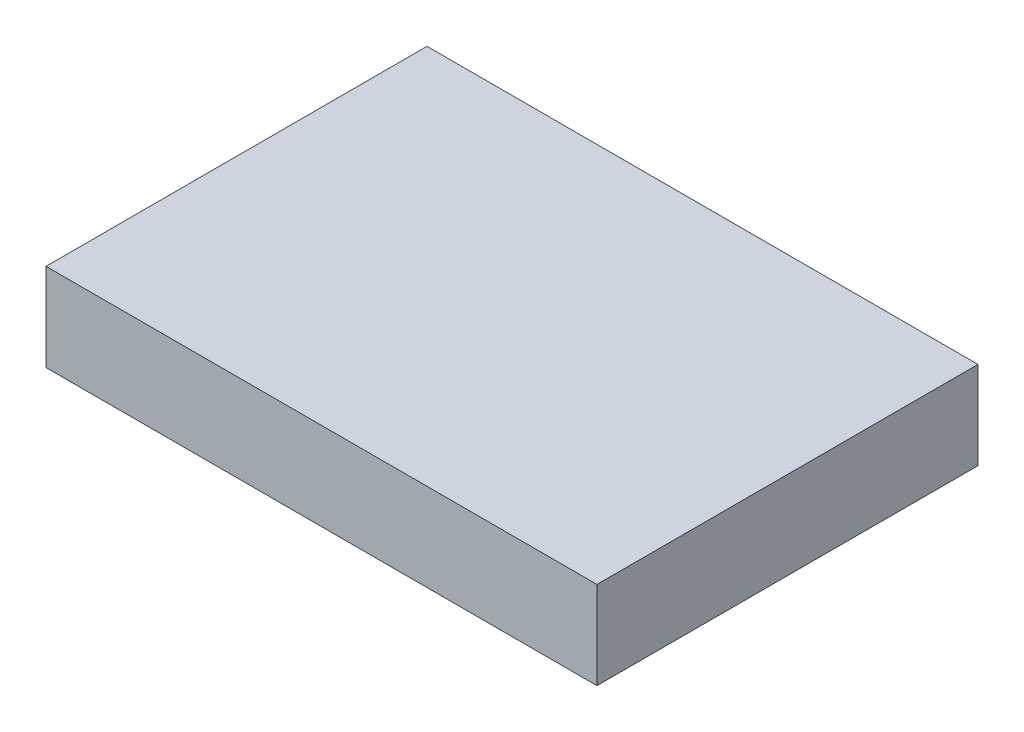
ISO-10303-21;
HEADER;
FILE_DESCRIPTION(('STEP AP214'),'2;1');
FILE_NAME('part.step','',(''),(''),'','','');
FILE_SCHEMA(('AUTOMOTIVE_DESIGN { 1 0 10303 214 1 1 1 1 }'));
ENDSEC;
DATA;
#1=APPLICATION_CONTEXT('core data for automotive mechanical design processes');
#2=APPLICATION_PROTOCOL_DEFINITION('international standard','automotive_design',2000,#1);
#3=PRODUCT_CONTEXT('',#1,'mechanical');
#4=PRODUCT('Part','Part','',(#3));
#5=PRODUCT_RELATED_PRODUCT_CATEGORY('part','',(#4));
#6=PRODUCT_DEFINITION_FORMATION('','',#4);
#7=PRODUCT_DEFINITION_CONTEXT('part definition',#1,'design');
#8=PRODUCT_DEFINITION('design','',#6,#7);
#9=PRODUCT_DEFINITION_SHAPE('','',#8);
#10=(LENGTH_UNIT() NAMED_UNIT(*) SI_UNIT(.MILLI.,.METRE.));
#11=(NAMED_UNIT(*) PLANE_ANGLE_UNIT() SI_UNIT($,.RADIAN.));
#12=(NAMED_UNIT(*) SI_UNIT($,.STERADIAN.) SOLID_ANGLE_UNIT());
#13=UNCERTAINTY_MEASURE_WITH_UNIT(LENGTH_MEASURE(1.E-05),#10,'distance_accuracy_value','');
#14=(GEOMETRIC_REPRESENTATION_CONTEXT(3) GLOBAL_UNCERTAINTY_ASSIGNED_CONTEXT((#13)) GLOBAL_UNIT_ASSIGNED_CONTEXT((#10,
#11,#12)) REPRESENTATION_CONTEXT('',''));
#15=CARTESIAN_POINT('',(0.,0.,0.));
#16=DIRECTION('',(0.,0.,1.));
#17=DIRECTION('',(1.,0.,0.));
#18=AXIS2_PLACEMENT_3D('',#15,#16,#17);
#19=CARTESIAN_POINT('',(4.15524413993215,1.,-14.4275647682955));
#20=DIRECTION('',(1.,0.,0.));
#21=DIRECTION('',(0.,0.,-1.));
#22=AXIS2_PLACEMENT_3D('',#19,#20,#21);
#23=PLANE('',#22);
#24=DIRECTION('',(0.,0.,1.));
#25=VECTOR('',#24,1.);
#26=CARTESIAN_POINT('',(4.15524413993215,0.,-14.4275647682955));
#27=LINE('',#26,#25);
#28=CARTESIAN_POINT('',(4.15524413993215,0.,-14.4275647682955));
#29=VERTEX_POINT('',#28);
#30=CARTESIAN_POINT('',(4.15524413993215,0.,-10.0820254014537));
#31=VERTEX_POINT('',#30);
#32=EDGE_CURVE('E96',#29,#31,#27,.T.);
#33=ORIENTED_EDGE('',*,*,#32,.T.);
#34=DIRECTION('',(0.,-1.,0.));
#35=VECTOR('',#34,1.);
#36=CARTESIAN_POINT('',(4.15524413993215,1.,-10.0820254014537));
#37=LINE('',#36,#35);
#38=CARTESIAN_POINT('',(4.15524413993215,1.,-10.0820254014537));
#39=VERTEX_POINT('',#38);
#40=EDGE_CURVE('E11',#39,#31,#37,.T.);
#41=ORIENTED_EDGE('',*,*,#40,.F.);
#42=DIRECTION('',(0.,0.,1.));
#43=VECTOR('',#42,1.);
#44=CARTESIAN_POINT('',(4.15524413993215,1.,-14.4275647682955));
#45=LINE('',#44,#43);
#46=CARTESIAN_POINT('',(4.15524413993215,1.,-14.4275647682955));
#47=VERTEX_POINT('',#46);
#48=EDGE_CURVE('E84',#47,#39,#45,.T.);
#49=ORIENTED_EDGE('',*,*,#48,.F.);
#50=DIRECTION('',(0.,-1.,0.));
#51=VECTOR('',#50,1.);
#52=CARTESIAN_POINT('',(4.15524413993215,1.,-14.4275647682955));
#53=LINE('',#52,#51);
#54=EDGE_CURVE('E92',#47,#29,#53,.T.);
#55=ORIENTED_EDGE('',*,*,#54,.T.);
#56=EDGE_LOOP('',(#33,#41,#49,#55));
#57=FACE_BOUND('',#56,.T.);
#58=ADVANCED_FACE('F33',(#57),#23,.F.);
#59=CARTESIAN_POINT('',(4.15524413993215,1.,-10.0820254014537));
#60=DIRECTION('',(0.,0.,-1.));
#61=DIRECTION('',(-1.,0.,0.));
#62=AXIS2_PLACEMENT_3D('',#59,#60,#61);
#63=PLANE('',#62);
#64=DIRECTION('',(1.,0.,0.));
#65=VECTOR('',#64,1.);
#66=CARTESIAN_POINT('',(4.15524413993215,0.,-10.0820254014537));
#67=LINE('',#66,#65);
#68=CARTESIAN_POINT('',(10.4386591703655,0.,-10.0820254014537));
#69=VERTEX_POINT('',#68);
#70=EDGE_CURVE('E88',#31,#69,#67,.T.);
#71=ORIENTED_EDGE('',*,*,#70,.T.);
#72=DIRECTION('',(0.,-1.,0.));
#73=VECTOR('',#72,1.);
#74=CARTESIAN_POINT('',(10.4386591703655,1.,-10.0820254014537));
#75=LINE('',#74,#73);
#76=CARTESIAN_POINT('',(10.4386591703655,1.,-10.0820254014537));
#77=VERTEX_POINT('',#76);
#78=EDGE_CURVE('E41',#77,#69,#75,.T.);
#79=ORIENTED_EDGE('',*,*,#78,.F.);
#80=DIRECTION('',(1.,0.,0.));
#81=VECTOR('',#80,1.);
#82=CARTESIAN_POINT('',(4.15524413993215,1.,-10.0820254014537));
#83=LINE('',#82,#81);
#84=EDGE_CURVE('E79',#39,#77,#83,.T.);
#85=ORIENTED_EDGE('',*,*,#84,.F.);
#86=ORIENTED_EDGE('',*,*,#40,.T.);
#87=EDGE_LOOP('',(#71,#79,#85,#86));
#88=FACE_BOUND('',#87,.T.);
#89=ADVANCED_FACE('F87',(#88),#63,.F.);
#90=CARTESIAN_POINT('',(10.4386591703655,1.,-14.4275647682955));
#91=DIRECTION('',(-1.,0.,0.));
#92=DIRECTION('',(0.,0.,1.));
#93=AXIS2_PLACEMENT_3D('',#90,#91,#92);
#94=PLANE('',#93);
#95=DIRECTION('',(0.,0.,-1.));
#96=VECTOR('',#95,1.);
#97=CARTESIAN_POINT('',(10.4386591703655,0.,-14.4275647682955));
#98=LINE('',#97,#96);
#99=CARTESIAN_POINT('',(10.4386591703655,0.,-14.4275647682955));
#100=VERTEX_POINT('',#99);
#101=EDGE_CURVE('E66',#69,#100,#98,.T.);
#102=ORIENTED_EDGE('',*,*,#101,.T.);
#103=DIRECTION('',(0.,-1.,0.));
#104=VECTOR('',#103,1.);
#105=CARTESIAN_POINT('',(10.4386591703655,1.,-14.4275647682955));
#106=LINE('',#105,#104);
#107=CARTESIAN_POINT('',(10.4386591703655,1.,-14.4275647682955));
#108=VERTEX_POINT('',#107);
#109=EDGE_CURVE('E89',#108,#100,#106,.T.);
#110=ORIENTED_EDGE('',*,*,#109,.F.);
#111=DIRECTION('',(0.,0.,-1.));
#112=VECTOR('',#111,1.);
#113=CARTESIAN_POINT('',(10.4386591703655,1.,-14.4275647682955));
#114=LINE('',#113,#112);
#115=EDGE_CURVE('E82',#77,#108,#114,.T.);
#116=ORIENTED_EDGE('',*,*,#115,.F.);
#117=ORIENTED_EDGE('',*,*,#78,.T.);
#118=EDGE_LOOP('',(#102,#110,#116,#117));
#119=FACE_BOUND('',#118,.T.);
#120=ADVANCED_FACE('F90',(#119),#94,.F.);
#121=CARTESIAN_POINT('',(4.15524413993215,1.,-14.4275647682955));
#122=DIRECTION('',(0.,0.,1.));
#123=DIRECTION('',(1.,0.,0.));
#124=AXIS2_PLACEMENT_3D('',#121,#122,#123);
#125=PLANE('',#124);
#126=DIRECTION('',(-1.,0.,0.));
#127=VECTOR('',#126,1.);
#128=CARTESIAN_POINT('',(4.15524413993215,0.,-14.4275647682955));
#129=LINE('',#128,#127);
#130=EDGE_CURVE('E72',#100,#29,#129,.T.);
#131=ORIENTED_EDGE('',*,*,#130,.T.);
#132=ORIENTED_EDGE('',*,*,#54,.F.);
#133=DIRECTION('',(-1.,0.,0.));
#134=VECTOR('',#133,1.);
#135=CARTESIAN_POINT('',(4.15524413993215,1.,-14.4275647682955));
#136=LINE('',#135,#134);
#137=EDGE_CURVE('E49',#108,#47,#136,.T.);
#138=ORIENTED_EDGE('',*,*,#137,.F.);
#139=ORIENTED_EDGE('',*,*,#109,.T.);
#140=EDGE_LOOP('',(#131,#132,#138,#139));
#141=FACE_BOUND('',#140,.T.);
#142=ADVANCED_FACE('F103',(#141),#125,.F.);
#143=CARTESIAN_POINT('',(0.,1.,0.));
#144=DIRECTION('',(0.,1.,0.));
#145=DIRECTION('',(0.,0.,1.));
#146=AXIS2_PLACEMENT_3D('',#143,#144,#145);
#147=PLANE('',#146);
#148=ORIENTED_EDGE('',*,*,#48,.T.);
#149=ORIENTED_EDGE('',*,*,#84,.T.);
#150=ORIENTED_EDGE('',*,*,#115,.T.);
#151=ORIENTED_EDGE('',*,*,#137,.T.);
#152=EDGE_LOOP('',(#148,#149,#150,#151));
#153=FACE_BOUND('',#152,.T.);
#154=ADVANCED_FACE('F80',(#153),#147,.T.);
#155=CARTESIAN_POINT('',(0.,0.,0.));
#156=DIRECTION('',(0.,1.,0.));
#157=DIRECTION('',(0.,0.,1.));
#158=AXIS2_PLACEMENT_3D('',#155,#156,#157);
#159=PLANE('',#158);
#160=ORIENTED_EDGE('',*,*,#32,.F.);
#161=ORIENTED_EDGE('',*,*,#130,.F.);
#162=ORIENTED_EDGE('',*,*,#101,.F.);
#163=ORIENTED_EDGE('',*,*,#70,.F.);
#164=EDGE_LOOP('',(#160,#161,#162,#163));
#165=FACE_BOUND('',#164,.T.);
#166=ADVANCED_FACE('F106',(#165),#159,.F.);
#167=CLOSED_SHELL('',(#58,#89,#120,#142,#154,#166));
#168=MANIFOLD_SOLID_BREP('B2',#167);
#169=ADVANCED_BREP_SHAPE_REPRESENTATION('',(#18,#168),#14);
#170=SHAPE_DEFINITION_REPRESENTATION(#9,#169);
ENDSEC;
END-ISO-10303-21;
